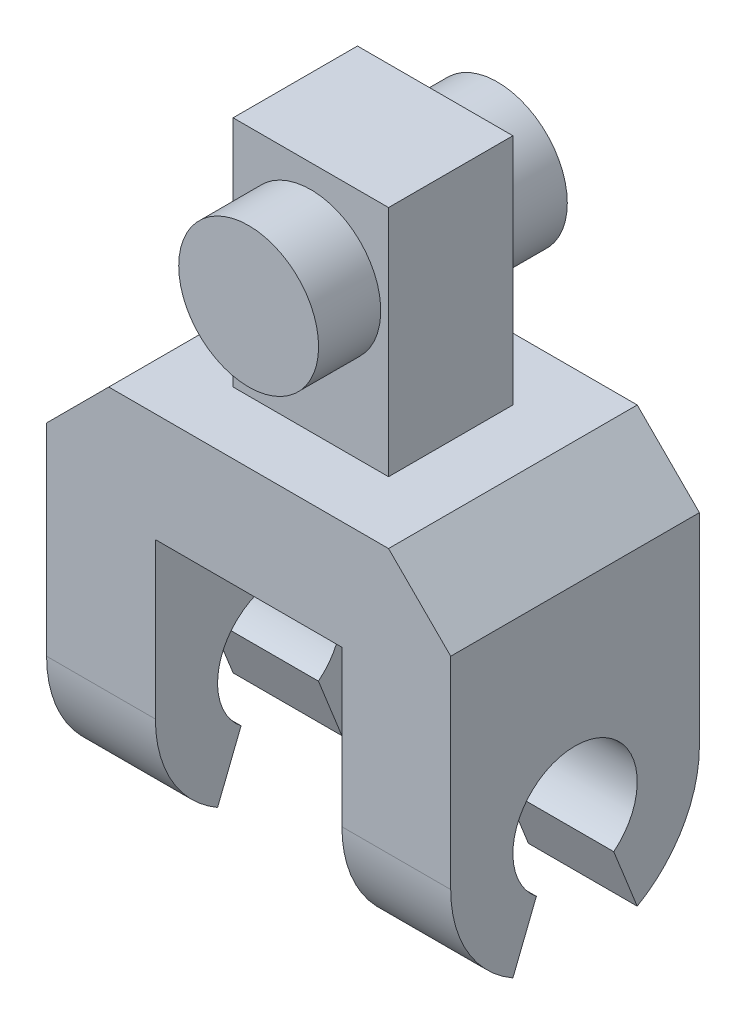
ISO-10303-21;
HEADER;
FILE_DESCRIPTION(('STEP AP214'),'2;1');
FILE_NAME('part.step','',(''),(''),'','','');
FILE_SCHEMA(('AUTOMOTIVE_DESIGN { 1 0 10303 214 1 1 1 1 }'));
ENDSEC;
DATA;
#1=APPLICATION_CONTEXT('core data for automotive mechanical design processes');
#2=APPLICATION_PROTOCOL_DEFINITION('international standard','automotive_design',2000,#1);
#3=PRODUCT_CONTEXT('',#1,'mechanical');
#4=PRODUCT('Part','Part','',(#3));
#5=PRODUCT_RELATED_PRODUCT_CATEGORY('part','',(#4));
#6=PRODUCT_DEFINITION_FORMATION('','',#4);
#7=PRODUCT_DEFINITION_CONTEXT('part definition',#1,'design');
#8=PRODUCT_DEFINITION('design','',#6,#7);
#9=PRODUCT_DEFINITION_SHAPE('','',#8);
#10=(LENGTH_UNIT() NAMED_UNIT(*) SI_UNIT(.MILLI.,.METRE.));
#11=(NAMED_UNIT(*) PLANE_ANGLE_UNIT() SI_UNIT($,.RADIAN.));
#12=(NAMED_UNIT(*) SI_UNIT($,.STERADIAN.) SOLID_ANGLE_UNIT());
#13=UNCERTAINTY_MEASURE_WITH_UNIT(LENGTH_MEASURE(1.E-05),#10,'distance_accuracy_value','');
#14=(GEOMETRIC_REPRESENTATION_CONTEXT(3) GLOBAL_UNCERTAINTY_ASSIGNED_CONTEXT((#13)) GLOBAL_UNIT_ASSIGNED_CONTEXT((#10,
#11,#12)) REPRESENTATION_CONTEXT('',''));
#15=CARTESIAN_POINT('',(0.,0.,0.));
#16=DIRECTION('',(0.,0.,1.));
#17=DIRECTION('',(1.,0.,0.));
#18=AXIS2_PLACEMENT_3D('',#15,#16,#17);
#19=CARTESIAN_POINT('',(-13.,0.,0.));
#20=DIRECTION('',(1.,0.,0.));
#21=DIRECTION('',(0.,0.,-1.));
#22=AXIS2_PLACEMENT_3D('',#19,#20,#21);
#23=CYLINDRICAL_SURFACE('',#22,8.);
#24=DIRECTION('',(-1.,0.,0.));
#25=VECTOR('',#24,1.);
#26=CARTESIAN_POINT('',(22.3648072874322,-6.92820323027551,4.));
#27=LINE('',#26,#25);
#28=CARTESIAN_POINT('',(-6.,-6.92820323027551,4.));
#29=VERTEX_POINT('',#28);
#30=CARTESIAN_POINT('',(-13.,-6.92820323027551,4.));
#31=VERTEX_POINT('',#30);
#32=EDGE_CURVE('E366',#29,#31,#27,.T.);
#33=ORIENTED_EDGE('',*,*,#32,.F.);
#34=CARTESIAN_POINT('',(-6.,0.,0.));
#35=DIRECTION('',(1.,0.,0.));
#36=DIRECTION('',(0.,0.,-1.));
#37=AXIS2_PLACEMENT_3D('',#34,#35,#36);
#38=CIRCLE('',#37,8.);
#39=CARTESIAN_POINT('',(-6.,0.,8.));
#40=VERTEX_POINT('',#39);
#41=EDGE_CURVE('E215',#40,#29,#38,.T.);
#42=ORIENTED_EDGE('',*,*,#41,.F.);
#43=DIRECTION('',(1.,0.,0.));
#44=VECTOR('',#43,1.);
#45=CARTESIAN_POINT('',(-13.,0.,8.));
#46=LINE('',#45,#44);
#47=CARTESIAN_POINT('',(-13.,0.,8.));
#48=VERTEX_POINT('',#47);
#49=EDGE_CURVE('E241',#48,#40,#46,.T.);
#50=ORIENTED_EDGE('',*,*,#49,.F.);
#51=CARTESIAN_POINT('',(-13.,0.,0.));
#52=DIRECTION('',(1.,0.,0.));
#53=DIRECTION('',(0.,0.,-1.));
#54=AXIS2_PLACEMENT_3D('',#51,#52,#53);
#55=CIRCLE('',#54,8.);
#56=EDGE_CURVE('E222',#48,#31,#55,.T.);
#57=ORIENTED_EDGE('',*,*,#56,.T.);
#58=EDGE_LOOP('',(#33,#42,#50,#57));
#59=FACE_BOUND('',#58,.T.);
#60=ADVANCED_FACE('F43',(#59),#23,.T.);
#61=CARTESIAN_POINT('',(13.,0.,0.));
#62=DIRECTION('',(-1.,0.,0.));
#63=DIRECTION('',(0.,0.,1.));
#64=AXIS2_PLACEMENT_3D('',#61,#62,#63);
#65=CYLINDRICAL_SURFACE('',#64,8.);
#66=CARTESIAN_POINT('',(6.,0.,0.));
#67=DIRECTION('',(1.,0.,0.));
#68=DIRECTION('',(0.,0.,-1.));
#69=AXIS2_PLACEMENT_3D('',#66,#67,#68);
#70=CIRCLE('',#69,8.);
#71=CARTESIAN_POINT('',(6.,0.,8.));
#72=VERTEX_POINT('',#71);
#73=CARTESIAN_POINT('',(6.,-6.92820323027551,4.));
#74=VERTEX_POINT('',#73);
#75=EDGE_CURVE('E322',#72,#74,#70,.T.);
#76=ORIENTED_EDGE('',*,*,#75,.T.);
#77=CARTESIAN_POINT('',(13.,-6.92820323027551,4.));
#78=VERTEX_POINT('',#77);
#79=EDGE_CURVE('E363',#78,#74,#27,.T.);
#80=ORIENTED_EDGE('',*,*,#79,.F.);
#81=CARTESIAN_POINT('',(13.,0.,0.));
#82=DIRECTION('',(1.,0.,0.));
#83=DIRECTION('',(0.,0.,-1.));
#84=AXIS2_PLACEMENT_3D('',#81,#82,#83);
#85=CIRCLE('',#84,8.);
#86=CARTESIAN_POINT('',(13.,0.,8.));
#87=VERTEX_POINT('',#86);
#88=EDGE_CURVE('E317',#87,#78,#85,.T.);
#89=ORIENTED_EDGE('',*,*,#88,.F.);
#90=DIRECTION('',(-1.,0.,0.));
#91=VECTOR('',#90,1.);
#92=CARTESIAN_POINT('',(13.,0.,8.));
#93=LINE('',#92,#91);
#94=EDGE_CURVE('E320',#87,#72,#93,.T.);
#95=ORIENTED_EDGE('',*,*,#94,.T.);
#96=EDGE_LOOP('',(#76,#80,#89,#95));
#97=FACE_BOUND('',#96,.T.);
#98=ADVANCED_FACE('F362',(#97),#65,.T.);
#99=CARTESIAN_POINT('',(0.,17.,0.));
#100=DIRECTION('',(0.,-1.,0.));
#101=DIRECTION('',(0.,0.,-1.));
#102=AXIS2_PLACEMENT_3D('',#99,#100,#101);
#103=PLANE('',#102);
#104=DIRECTION('',(-1.,0.,0.));
#105=VECTOR('',#104,1.);
#106=CARTESIAN_POINT('',(13.,17.,-8.));
#107=LINE('',#106,#105);
#108=CARTESIAN_POINT('',(9.00000000000001,17.,-8.));
#109=VERTEX_POINT('',#108);
#110=CARTESIAN_POINT('',(-9.00000000000001,17.,-8.));
#111=VERTEX_POINT('',#110);
#112=EDGE_CURVE('E341',#109,#111,#107,.T.);
#113=ORIENTED_EDGE('',*,*,#112,.T.);
#114=DIRECTION('',(0.,0.,1.));
#115=VECTOR('',#114,1.);
#116=CARTESIAN_POINT('',(-9.00000000000001,17.,0.));
#117=LINE('',#116,#115);
#118=CARTESIAN_POINT('',(-9.00000000000001,17.,8.));
#119=VERTEX_POINT('',#118);
#120=EDGE_CURVE('E248',#111,#119,#117,.T.);
#121=ORIENTED_EDGE('',*,*,#120,.T.);
#122=DIRECTION('',(1.,0.,0.));
#123=VECTOR('',#122,1.);
#124=CARTESIAN_POINT('',(13.,17.,8.));
#125=LINE('',#124,#123);
#126=CARTESIAN_POINT('',(9.00000000000001,17.,8.));
#127=VERTEX_POINT('',#126);
#128=EDGE_CURVE('E338',#119,#127,#125,.T.);
#129=ORIENTED_EDGE('',*,*,#128,.T.);
#130=DIRECTION('',(0.,0.,-1.));
#131=VECTOR('',#130,1.);
#132=CARTESIAN_POINT('',(9.00000000000001,17.,0.));
#133=LINE('',#132,#131);
#134=EDGE_CURVE('E243',#127,#109,#133,.T.);
#135=ORIENTED_EDGE('',*,*,#134,.T.);
#136=EDGE_LOOP('',(#113,#121,#129,#135));
#137=FACE_BOUND('',#136,.T.);
#138=DIRECTION('',(0.,0.,-1.));
#139=VECTOR('',#138,1.);
#140=CARTESIAN_POINT('',(5.,17.,-4.));
#141=LINE('',#140,#139);
#142=CARTESIAN_POINT('',(5.,17.,4.));
#143=VERTEX_POINT('',#142);
#144=CARTESIAN_POINT('',(5.,17.,-4.));
#145=VERTEX_POINT('',#144);
#146=EDGE_CURVE('E295',#143,#145,#141,.T.);
#147=ORIENTED_EDGE('',*,*,#146,.F.);
#148=DIRECTION('',(1.,0.,0.));
#149=VECTOR('',#148,1.);
#150=CARTESIAN_POINT('',(-5.,17.,4.));
#151=LINE('',#150,#149);
#152=CARTESIAN_POINT('',(-5.,17.,4.));
#153=VERTEX_POINT('',#152);
#154=EDGE_CURVE('E279',#153,#143,#151,.T.);
#155=ORIENTED_EDGE('',*,*,#154,.F.);
#156=DIRECTION('',(0.,0.,1.));
#157=VECTOR('',#156,1.);
#158=CARTESIAN_POINT('',(-5.,17.,-4.));
#159=LINE('',#158,#157);
#160=CARTESIAN_POINT('',(-5.,17.,-4.));
#161=VERTEX_POINT('',#160);
#162=EDGE_CURVE('E289',#161,#153,#159,.T.);
#163=ORIENTED_EDGE('',*,*,#162,.F.);
#164=DIRECTION('',(-1.,0.,0.));
#165=VECTOR('',#164,1.);
#166=CARTESIAN_POINT('',(-5.,17.,-4.));
#167=LINE('',#166,#165);
#168=EDGE_CURVE('E398',#145,#161,#167,.T.);
#169=ORIENTED_EDGE('',*,*,#168,.F.);
#170=EDGE_LOOP('',(#147,#155,#163,#169));
#171=FACE_BOUND('',#170,.T.);
#172=ADVANCED_FACE('F403',(#137,#171),#103,.F.);
#173=CARTESIAN_POINT('',(0.,10.,0.));
#174=DIRECTION('',(0.,-1.,0.));
#175=DIRECTION('',(0.,0.,-1.));
#176=AXIS2_PLACEMENT_3D('',#173,#174,#175);
#177=PLANE('',#176);
#178=DIRECTION('',(-1.,0.,0.));
#179=VECTOR('',#178,1.);
#180=CARTESIAN_POINT('',(13.,10.,-8.));
#181=LINE('',#180,#179);
#182=CARTESIAN_POINT('',(6.,10.,-8.));
#183=VERTEX_POINT('',#182);
#184=CARTESIAN_POINT('',(-6.,10.,-8.));
#185=VERTEX_POINT('',#184);
#186=EDGE_CURVE('E342',#183,#185,#181,.T.);
#187=ORIENTED_EDGE('',*,*,#186,.F.);
#188=DIRECTION('',(0.,0.,1.));
#189=VECTOR('',#188,1.);
#190=CARTESIAN_POINT('',(6.,10.,8.));
#191=LINE('',#190,#189);
#192=CARTESIAN_POINT('',(6.,10.,8.));
#193=VERTEX_POINT('',#192);
#194=EDGE_CURVE('E327',#183,#193,#191,.T.);
#195=ORIENTED_EDGE('',*,*,#194,.T.);
#196=DIRECTION('',(1.,0.,0.));
#197=VECTOR('',#196,1.);
#198=CARTESIAN_POINT('',(13.,10.,8.));
#199=LINE('',#198,#197);
#200=CARTESIAN_POINT('',(-6.,10.,8.));
#201=VERTEX_POINT('',#200);
#202=EDGE_CURVE('E337',#201,#193,#199,.T.);
#203=ORIENTED_EDGE('',*,*,#202,.F.);
#204=DIRECTION('',(0.,0.,1.));
#205=VECTOR('',#204,1.);
#206=CARTESIAN_POINT('',(-6.,10.,8.));
#207=LINE('',#206,#205);
#208=EDGE_CURVE('E235',#185,#201,#207,.T.);
#209=ORIENTED_EDGE('',*,*,#208,.F.);
#210=EDGE_LOOP('',(#187,#195,#203,#209));
#211=FACE_BOUND('',#210,.T.);
#212=ADVANCED_FACE('F431',(#211),#177,.T.);
#213=DIRECTION('',(-1.,0.,0.));
#214=VECTOR('',#213,1.);
#215=CARTESIAN_POINT('',(22.3648072874322,-6.92820323027551,-4.));
#216=LINE('',#215,#214);
#217=CARTESIAN_POINT('',(-6.,-6.92820323027551,-4.));
#218=VERTEX_POINT('',#217);
#219=CARTESIAN_POINT('',(-13.,-6.92820323027551,-4.));
#220=VERTEX_POINT('',#219);
#221=EDGE_CURVE('E374',#218,#220,#216,.T.);
#222=ORIENTED_EDGE('',*,*,#221,.T.);
#223=CARTESIAN_POINT('',(-13.,0.,-8.));
#224=VERTEX_POINT('',#223);
#225=EDGE_CURVE('E208',#220,#224,#55,.T.);
#226=ORIENTED_EDGE('',*,*,#225,.T.);
#227=DIRECTION('',(1.,0.,0.));
#228=VECTOR('',#227,1.);
#229=CARTESIAN_POINT('',(-13.,0.,-8.));
#230=LINE('',#229,#228);
#231=CARTESIAN_POINT('',(-6.,0.,-8.));
#232=VERTEX_POINT('',#231);
#233=EDGE_CURVE('E229',#224,#232,#230,.T.);
#234=ORIENTED_EDGE('',*,*,#233,.T.);
#235=EDGE_CURVE('E212',#218,#232,#38,.T.);
#236=ORIENTED_EDGE('',*,*,#235,.F.);
#237=EDGE_LOOP('',(#222,#226,#234,#236));
#238=FACE_BOUND('',#237,.T.);
#239=ADVANCED_FACE('F421',(#238),#23,.T.);
#240=CARTESIAN_POINT('',(-13.,0.,8.));
#241=DIRECTION('',(0.,0.,1.));
#242=DIRECTION('',(1.,0.,0.));
#243=AXIS2_PLACEMENT_3D('',#240,#241,#242);
#244=PLANE('',#243);
#245=ORIENTED_EDGE('',*,*,#128,.F.);
#246=DIRECTION('',(0.707106781186546,0.707106781186549,0.));
#247=VECTOR('',#246,1.);
#248=CARTESIAN_POINT('',(-19.5,6.49999999999997,8.));
#249=LINE('',#248,#247);
#250=CARTESIAN_POINT('',(-13.,13.,8.));
#251=VERTEX_POINT('',#250);
#252=EDGE_CURVE('E253',#119,#251,#249,.F.);
#253=ORIENTED_EDGE('',*,*,#252,.T.);
#254=DIRECTION('',(0.,-1.,0.));
#255=VECTOR('',#254,1.);
#256=CARTESIAN_POINT('',(-13.,0.,8.));
#257=LINE('',#256,#255);
#258=EDGE_CURVE('E228',#251,#48,#257,.T.);
#259=ORIENTED_EDGE('',*,*,#258,.T.);
#260=ORIENTED_EDGE('',*,*,#49,.T.);
#261=DIRECTION('',(0.,-1.,0.));
#262=VECTOR('',#261,1.);
#263=CARTESIAN_POINT('',(-6.,0.,8.));
#264=LINE('',#263,#262);
#265=EDGE_CURVE('E238',#201,#40,#264,.T.);
#266=ORIENTED_EDGE('',*,*,#265,.F.);
#267=ORIENTED_EDGE('',*,*,#202,.T.);
#268=DIRECTION('',(0.,-1.,0.));
#269=VECTOR('',#268,1.);
#270=CARTESIAN_POINT('',(6.,0.,8.));
#271=LINE('',#270,#269);
#272=EDGE_CURVE('E330',#193,#72,#271,.T.);
#273=ORIENTED_EDGE('',*,*,#272,.T.);
#274=ORIENTED_EDGE('',*,*,#94,.F.);
#275=DIRECTION('',(0.,-1.,0.));
#276=VECTOR('',#275,1.);
#277=CARTESIAN_POINT('',(13.,17.,8.));
#278=LINE('',#277,#276);
#279=CARTESIAN_POINT('',(13.,13.,8.));
#280=VERTEX_POINT('',#279);
#281=EDGE_CURVE('E217',#280,#87,#278,.T.);
#282=ORIENTED_EDGE('',*,*,#281,.F.);
#283=DIRECTION('',(0.707106781186546,-0.707106781186549,0.));
#284=VECTOR('',#283,1.);
#285=CARTESIAN_POINT('',(6.50000000000004,19.5,8.));
#286=LINE('',#285,#284);
#287=EDGE_CURVE('E251',#280,#127,#286,.F.);
#288=ORIENTED_EDGE('',*,*,#287,.T.);
#289=EDGE_LOOP('',(#245,#253,#259,#260,#266,#267,#273,#274,#282,#288));
#290=FACE_BOUND('',#289,.T.);
#291=ADVANCED_FACE('F358',(#290),#244,.T.);
#292=CARTESIAN_POINT('',(-13.,10.,-8.));
#293=DIRECTION('',(0.,0.,-1.));
#294=DIRECTION('',(0.,1.,0.));
#295=AXIS2_PLACEMENT_3D('',#292,#293,#294);
#296=PLANE('',#295);
#297=DIRECTION('',(0.,1.,0.));
#298=VECTOR('',#297,1.);
#299=CARTESIAN_POINT('',(-13.,10.,-8.));
#300=LINE('',#299,#298);
#301=CARTESIAN_POINT('',(-13.,13.,-8.));
#302=VERTEX_POINT('',#301);
#303=EDGE_CURVE('E225',#224,#302,#300,.T.);
#304=ORIENTED_EDGE('',*,*,#303,.T.);
#305=DIRECTION('',(-0.707106781186546,-0.707106781186549,0.));
#306=VECTOR('',#305,1.);
#307=CARTESIAN_POINT('',(-14.5,11.5,-8.));
#308=LINE('',#307,#306);
#309=EDGE_CURVE('E259',#302,#111,#308,.F.);
#310=ORIENTED_EDGE('',*,*,#309,.T.);
#311=ORIENTED_EDGE('',*,*,#112,.F.);
#312=DIRECTION('',(-0.707106781186546,0.707106781186549,0.));
#313=VECTOR('',#312,1.);
#314=CARTESIAN_POINT('',(1.50000000000004,24.5,-8.));
#315=LINE('',#314,#313);
#316=CARTESIAN_POINT('',(13.,13.,-8.));
#317=VERTEX_POINT('',#316);
#318=EDGE_CURVE('E257',#109,#317,#315,.F.);
#319=ORIENTED_EDGE('',*,*,#318,.T.);
#320=DIRECTION('',(0.,-1.,0.));
#321=VECTOR('',#320,1.);
#322=CARTESIAN_POINT('',(13.,17.,-8.));
#323=LINE('',#322,#321);
#324=CARTESIAN_POINT('',(13.,0.,-8.));
#325=VERTEX_POINT('',#324);
#326=EDGE_CURVE('E345',#317,#325,#323,.T.);
#327=ORIENTED_EDGE('',*,*,#326,.T.);
#328=DIRECTION('',(-1.,0.,0.));
#329=VECTOR('',#328,1.);
#330=CARTESIAN_POINT('',(13.,0.,-8.));
#331=LINE('',#330,#329);
#332=CARTESIAN_POINT('',(6.,0.,-8.));
#333=VERTEX_POINT('',#332);
#334=EDGE_CURVE('E334',#325,#333,#331,.T.);
#335=ORIENTED_EDGE('',*,*,#334,.T.);
#336=DIRECTION('',(0.,1.,0.));
#337=VECTOR('',#336,1.);
#338=CARTESIAN_POINT('',(6.,10.,-8.));
#339=LINE('',#338,#337);
#340=EDGE_CURVE('E325',#333,#183,#339,.T.);
#341=ORIENTED_EDGE('',*,*,#340,.T.);
#342=ORIENTED_EDGE('',*,*,#186,.T.);
#343=DIRECTION('',(0.,1.,0.));
#344=VECTOR('',#343,1.);
#345=CARTESIAN_POINT('',(-6.,10.,-8.));
#346=LINE('',#345,#344);
#347=EDGE_CURVE('E232',#232,#185,#346,.T.);
#348=ORIENTED_EDGE('',*,*,#347,.F.);
#349=ORIENTED_EDGE('',*,*,#233,.F.);
#350=EDGE_LOOP('',(#304,#310,#311,#319,#327,#335,#341,#342,#348,#349));
#351=FACE_BOUND('',#350,.T.);
#352=ADVANCED_FACE('F437',(#351),#296,.T.);
#353=CARTESIAN_POINT('',(-13.,0.,0.));
#354=DIRECTION('',(1.,0.,0.));
#355=DIRECTION('',(0.,0.,-1.));
#356=AXIS2_PLACEMENT_3D('',#353,#354,#355);
#357=PLANE('',#356);
#358=CARTESIAN_POINT('',(-13.,0.,0.));
#359=DIRECTION('',(1.,0.,0.));
#360=DIRECTION('',(0.,0.,-1.));
#361=AXIS2_PLACEMENT_3D('',#358,#359,#360);
#362=CIRCLE('',#361,4.);
#363=CARTESIAN_POINT('',(-13.,-3.13177490960591,-2.48837013234826));
#364=VERTEX_POINT('',#363);
#365=CARTESIAN_POINT('',(-13.,-3.13177490960591,2.48837013234826));
#366=VERTEX_POINT('',#365);
#367=EDGE_CURVE('E206',#364,#366,#362,.T.);
#368=ORIENTED_EDGE('',*,*,#367,.T.);
#369=DIRECTION('',(0.,0.929061299169729,-0.369925806595128));
#370=VECTOR('',#369,1.);
#371=CARTESIAN_POINT('',(-13.,-3.13177490960591,2.48837013234826));
#372=LINE('',#371,#370);
#373=EDGE_CURVE('E68',#31,#366,#372,.T.);
#374=ORIENTED_EDGE('',*,*,#373,.F.);
#375=ORIENTED_EDGE('',*,*,#56,.F.);
#376=ORIENTED_EDGE('',*,*,#258,.F.);
#377=DIRECTION('',(0.,0.,-1.));
#378=VECTOR('',#377,1.);
#379=CARTESIAN_POINT('',(-13.,13.,0.));
#380=LINE('',#379,#378);
#381=EDGE_CURVE('E255',#251,#302,#380,.T.);
#382=ORIENTED_EDGE('',*,*,#381,.T.);
#383=ORIENTED_EDGE('',*,*,#303,.F.);
#384=ORIENTED_EDGE('',*,*,#225,.F.);
#385=DIRECTION('',(0.,-0.929061299169729,-0.369925806595128));
#386=VECTOR('',#385,1.);
#387=CARTESIAN_POINT('',(-13.,-3.13177490960591,-2.48837013234826));
#388=LINE('',#387,#386);
#389=EDGE_CURVE('E194',#364,#220,#388,.T.);
#390=ORIENTED_EDGE('',*,*,#389,.F.);
#391=EDGE_LOOP('',(#368,#374,#375,#376,#382,#383,#384,#390));
#392=FACE_BOUND('',#391,.T.);
#393=ADVANCED_FACE('F205',(#392),#357,.F.);
#394=CARTESIAN_POINT('',(-6.,0.,0.));
#395=DIRECTION('',(1.,0.,0.));
#396=DIRECTION('',(0.,0.,-1.));
#397=AXIS2_PLACEMENT_3D('',#394,#395,#396);
#398=PLANE('',#397);
#399=DIRECTION('',(0.,-0.929061299169729,0.369925806595128));
#400=VECTOR('',#399,1.);
#401=CARTESIAN_POINT('',(-6.,0.42664432149519,1.07150872024869));
#402=LINE('',#401,#400);
#403=CARTESIAN_POINT('',(-6.,-3.13177490960591,2.48837013234826));
#404=VERTEX_POINT('',#403);
#405=EDGE_CURVE('E385',#404,#29,#402,.T.);
#406=ORIENTED_EDGE('',*,*,#405,.F.);
#407=CARTESIAN_POINT('',(-6.,0.,0.));
#408=DIRECTION('',(1.,0.,0.));
#409=DIRECTION('',(0.,0.,-1.));
#410=AXIS2_PLACEMENT_3D('',#407,#408,#409);
#411=CIRCLE('',#410,4.);
#412=CARTESIAN_POINT('',(-6.,-3.13177490960591,-2.48837013234826));
#413=VERTEX_POINT('',#412);
#414=EDGE_CURVE('E213',#413,#404,#411,.T.);
#415=ORIENTED_EDGE('',*,*,#414,.F.);
#416=DIRECTION('',(0.,0.929061299169729,0.369925806595128));
#417=VECTOR('',#416,1.);
#418=CARTESIAN_POINT('',(-6.,0.42664432149519,-1.07150872024869));
#419=LINE('',#418,#417);
#420=EDGE_CURVE('E60',#218,#413,#419,.T.);
#421=ORIENTED_EDGE('',*,*,#420,.F.);
#422=ORIENTED_EDGE('',*,*,#235,.T.);
#423=ORIENTED_EDGE('',*,*,#347,.T.);
#424=ORIENTED_EDGE('',*,*,#208,.T.);
#425=ORIENTED_EDGE('',*,*,#265,.T.);
#426=ORIENTED_EDGE('',*,*,#41,.T.);
#427=EDGE_LOOP('',(#406,#415,#421,#422,#423,#424,#425,#426));
#428=FACE_BOUND('',#427,.T.);
#429=ADVANCED_FACE('F446',(#428),#398,.T.);
#430=CARTESIAN_POINT('',(-13.,0.,0.));
#431=DIRECTION('',(1.,0.,0.));
#432=DIRECTION('',(0.,0.,-1.));
#433=AXIS2_PLACEMENT_3D('',#430,#431,#432);
#434=CYLINDRICAL_SURFACE('',#433,4.);
#435=ORIENTED_EDGE('',*,*,#414,.T.);
#436=DIRECTION('',(-1.,0.,0.));
#437=VECTOR('',#436,1.);
#438=CARTESIAN_POINT('',(22.3648072874322,-3.13177490960591,2.48837013234826));
#439=LINE('',#438,#437);
#440=EDGE_CURVE('E211',#404,#366,#439,.T.);
#441=ORIENTED_EDGE('',*,*,#440,.T.);
#442=ORIENTED_EDGE('',*,*,#367,.F.);
#443=DIRECTION('',(-1.,0.,0.));
#444=VECTOR('',#443,1.);
#445=CARTESIAN_POINT('',(22.3648072874322,-3.13177490960591,-2.48837013234826));
#446=LINE('',#445,#444);
#447=EDGE_CURVE('E191',#413,#364,#446,.T.);
#448=ORIENTED_EDGE('',*,*,#447,.F.);
#449=EDGE_LOOP('',(#435,#441,#442,#448));
#450=FACE_BOUND('',#449,.T.);
#451=ADVANCED_FACE('F210',(#450),#434,.F.);
#452=CARTESIAN_POINT('',(13.,17.,-8.));
#453=DIRECTION('',(-1.,0.,0.));
#454=DIRECTION('',(0.,0.,1.));
#455=AXIS2_PLACEMENT_3D('',#452,#453,#454);
#456=PLANE('',#455);
#457=ORIENTED_EDGE('',*,*,#88,.T.);
#458=DIRECTION('',(0.,-0.929061299169729,0.369925806595128));
#459=VECTOR('',#458,1.);
#460=CARTESIAN_POINT('',(13.,-3.13177490960591,2.48837013234826));
#461=LINE('',#460,#459);
#462=CARTESIAN_POINT('',(13.,-3.13177490960591,2.48837013234826));
#463=VERTEX_POINT('',#462);
#464=EDGE_CURVE('E379',#463,#78,#461,.T.);
#465=ORIENTED_EDGE('',*,*,#464,.F.);
#466=CARTESIAN_POINT('',(13.,0.,0.));
#467=DIRECTION('',(1.,0.,0.));
#468=DIRECTION('',(0.,0.,-1.));
#469=AXIS2_PLACEMENT_3D('',#466,#467,#468);
#470=CIRCLE('',#469,4.);
#471=CARTESIAN_POINT('',(13.,-3.13177490960591,-2.48837013234826));
#472=VERTEX_POINT('',#471);
#473=EDGE_CURVE('E311',#472,#463,#470,.T.);
#474=ORIENTED_EDGE('',*,*,#473,.F.);
#475=DIRECTION('',(0.,0.929061299169729,0.369925806595128));
#476=VECTOR('',#475,1.);
#477=CARTESIAN_POINT('',(13.,-3.13177490960591,-2.48837013234826));
#478=LINE('',#477,#476);
#479=CARTESIAN_POINT('',(13.,-6.92820323027551,-4.));
#480=VERTEX_POINT('',#479);
#481=EDGE_CURVE('E376',#480,#472,#478,.T.);
#482=ORIENTED_EDGE('',*,*,#481,.F.);
#483=EDGE_CURVE('E321',#480,#325,#85,.T.);
#484=ORIENTED_EDGE('',*,*,#483,.T.);
#485=ORIENTED_EDGE('',*,*,#326,.F.);
#486=DIRECTION('',(0.,0.,1.));
#487=VECTOR('',#486,1.);
#488=CARTESIAN_POINT('',(13.,13.,-8.));
#489=LINE('',#488,#487);
#490=EDGE_CURVE('E260',#317,#280,#489,.T.);
#491=ORIENTED_EDGE('',*,*,#490,.T.);
#492=ORIENTED_EDGE('',*,*,#281,.T.);
#493=EDGE_LOOP('',(#457,#465,#474,#482,#484,#485,#491,#492));
#494=FACE_BOUND('',#493,.T.);
#495=ADVANCED_FACE('F352',(#494),#456,.F.);
#496=CARTESIAN_POINT('',(6.,0.,0.));
#497=DIRECTION('',(1.,0.,0.));
#498=DIRECTION('',(0.,0.,-1.));
#499=AXIS2_PLACEMENT_3D('',#496,#497,#498);
#500=PLANE('',#499);
#501=CARTESIAN_POINT('',(6.,0.,0.));
#502=DIRECTION('',(1.,0.,0.));
#503=DIRECTION('',(0.,0.,-1.));
#504=AXIS2_PLACEMENT_3D('',#501,#502,#503);
#505=CIRCLE('',#504,4.);
#506=CARTESIAN_POINT('',(6.,-3.13177490960591,-2.48837013234826));
#507=VERTEX_POINT('',#506);
#508=CARTESIAN_POINT('',(6.,-3.13177490960591,2.48837013234826));
#509=VERTEX_POINT('',#508);
#510=EDGE_CURVE('E310',#507,#509,#505,.T.);
#511=ORIENTED_EDGE('',*,*,#510,.T.);
#512=DIRECTION('',(0.,-0.929061299169729,0.369925806595128));
#513=VECTOR('',#512,1.);
#514=CARTESIAN_POINT('',(6.,0.42664432149519,1.07150872024869));
#515=LINE('',#514,#513);
#516=EDGE_CURVE('E383',#509,#74,#515,.T.);
#517=ORIENTED_EDGE('',*,*,#516,.T.);
#518=ORIENTED_EDGE('',*,*,#75,.F.);
#519=ORIENTED_EDGE('',*,*,#272,.F.);
#520=ORIENTED_EDGE('',*,*,#194,.F.);
#521=ORIENTED_EDGE('',*,*,#340,.F.);
#522=CARTESIAN_POINT('',(6.,-6.92820323027551,-4.));
#523=VERTEX_POINT('',#522);
#524=EDGE_CURVE('E314',#523,#333,#70,.T.);
#525=ORIENTED_EDGE('',*,*,#524,.F.);
#526=DIRECTION('',(0.,0.929061299169729,0.369925806595128));
#527=VECTOR('',#526,1.);
#528=CARTESIAN_POINT('',(6.,0.42664432149519,-1.07150872024869));
#529=LINE('',#528,#527);
#530=EDGE_CURVE('E378',#523,#507,#529,.T.);
#531=ORIENTED_EDGE('',*,*,#530,.T.);
#532=EDGE_LOOP('',(#511,#517,#518,#519,#520,#521,#525,#531));
#533=FACE_BOUND('',#532,.T.);
#534=ADVANCED_FACE('F461',(#533),#500,.F.);
#535=ORIENTED_EDGE('',*,*,#483,.F.);
#536=EDGE_CURVE('E370',#480,#523,#216,.T.);
#537=ORIENTED_EDGE('',*,*,#536,.T.);
#538=ORIENTED_EDGE('',*,*,#524,.T.);
#539=ORIENTED_EDGE('',*,*,#334,.F.);
#540=EDGE_LOOP('',(#535,#537,#538,#539));
#541=FACE_BOUND('',#540,.T.);
#542=ADVANCED_FACE('F427',(#541),#65,.T.);
#543=CARTESIAN_POINT('',(13.,0.,0.));
#544=DIRECTION('',(-1.,0.,0.));
#545=DIRECTION('',(0.,0.,1.));
#546=AXIS2_PLACEMENT_3D('',#543,#544,#545);
#547=CYLINDRICAL_SURFACE('',#546,4.);
#548=EDGE_CURVE('E368',#463,#509,#439,.T.);
#549=ORIENTED_EDGE('',*,*,#548,.T.);
#550=ORIENTED_EDGE('',*,*,#510,.F.);
#551=EDGE_CURVE('E200',#472,#507,#446,.T.);
#552=ORIENTED_EDGE('',*,*,#551,.F.);
#553=ORIENTED_EDGE('',*,*,#473,.T.);
#554=EDGE_LOOP('',(#549,#550,#552,#553));
#555=FACE_BOUND('',#554,.T.);
#556=ADVANCED_FACE('F457',(#555),#547,.F.);
#557=CARTESIAN_POINT('',(-9.00000000000001,17.,0.));
#558=DIRECTION('',(0.707106781186549,-0.707106781186546,0.));
#559=DIRECTION('',(0.,0.,1.));
#560=AXIS2_PLACEMENT_3D('',#557,#558,#559);
#561=PLANE('',#560);
#562=ORIENTED_EDGE('',*,*,#309,.F.);
#563=ORIENTED_EDGE('',*,*,#381,.F.);
#564=ORIENTED_EDGE('',*,*,#252,.F.);
#565=ORIENTED_EDGE('',*,*,#120,.F.);
#566=EDGE_LOOP('',(#562,#563,#564,#565));
#567=FACE_BOUND('',#566,.T.);
#568=ADVANCED_FACE('F476',(#567),#561,.F.);
#569=CARTESIAN_POINT('',(9.00000000000001,17.,0.));
#570=DIRECTION('',(-0.707106781186549,-0.707106781186546,0.));
#571=DIRECTION('',(0.,0.,-1.));
#572=AXIS2_PLACEMENT_3D('',#569,#570,#571);
#573=PLANE('',#572);
#574=ORIENTED_EDGE('',*,*,#287,.F.);
#575=ORIENTED_EDGE('',*,*,#490,.F.);
#576=ORIENTED_EDGE('',*,*,#318,.F.);
#577=ORIENTED_EDGE('',*,*,#134,.F.);
#578=EDGE_LOOP('',(#574,#575,#576,#577));
#579=FACE_BOUND('',#578,.T.);
#580=ADVANCED_FACE('F46',(#579),#573,.F.);
#581=CARTESIAN_POINT('',(5.,32.,-4.));
#582=DIRECTION('',(-1.,0.,0.));
#583=DIRECTION('',(0.,0.,1.));
#584=AXIS2_PLACEMENT_3D('',#581,#582,#583);
#585=PLANE('',#584);
#586=ORIENTED_EDGE('',*,*,#146,.T.);
#587=DIRECTION('',(0.,-1.,0.));
#588=VECTOR('',#587,1.);
#589=CARTESIAN_POINT('',(5.,32.,-4.));
#590=LINE('',#589,#588);
#591=CARTESIAN_POINT('',(5.,32.,-4.));
#592=VERTEX_POINT('',#591);
#593=EDGE_CURVE('E307',#592,#145,#590,.T.);
#594=ORIENTED_EDGE('',*,*,#593,.F.);
#595=DIRECTION('',(0.,0.,-1.));
#596=VECTOR('',#595,1.);
#597=CARTESIAN_POINT('',(5.,32.,-4.));
#598=LINE('',#597,#596);
#599=CARTESIAN_POINT('',(5.,32.,4.));
#600=VERTEX_POINT('',#599);
#601=EDGE_CURVE('E288',#600,#592,#598,.T.);
#602=ORIENTED_EDGE('',*,*,#601,.F.);
#603=DIRECTION('',(0.,-1.,0.));
#604=VECTOR('',#603,1.);
#605=CARTESIAN_POINT('',(5.,32.,4.));
#606=LINE('',#605,#604);
#607=EDGE_CURVE('E282',#600,#143,#606,.T.);
#608=ORIENTED_EDGE('',*,*,#607,.T.);
#609=EDGE_LOOP('',(#586,#594,#602,#608));
#610=FACE_BOUND('',#609,.T.);
#611=ADVANCED_FACE('F293',(#610),#585,.F.);
#612=CARTESIAN_POINT('',(-5.,32.,-4.));
#613=DIRECTION('',(0.,0.,1.));
#614=DIRECTION('',(1.,0.,0.));
#615=AXIS2_PLACEMENT_3D('',#612,#613,#614);
#616=PLANE('',#615);
#617=CARTESIAN_POINT('',(0.,26.,-4.));
#618=DIRECTION('',(0.,0.,1.));
#619=DIRECTION('',(1.,0.,0.));
#620=AXIS2_PLACEMENT_3D('',#617,#618,#619);
#621=CIRCLE('',#620,4.5);
#622=CARTESIAN_POINT('',(4.5,26.,-4.));
#623=VERTEX_POINT('',#622);
#624=EDGE_CURVE('E11',#623,#623,#621,.F.);
#625=ORIENTED_EDGE('',*,*,#624,.F.);
#626=EDGE_LOOP('',(#625));
#627=FACE_BOUND('',#626,.T.);
#628=ORIENTED_EDGE('',*,*,#168,.T.);
#629=DIRECTION('',(0.,-1.,0.));
#630=VECTOR('',#629,1.);
#631=CARTESIAN_POINT('',(-5.,32.,-4.));
#632=LINE('',#631,#630);
#633=CARTESIAN_POINT('',(-5.,32.,-4.));
#634=VERTEX_POINT('',#633);
#635=EDGE_CURVE('E299',#634,#161,#632,.T.);
#636=ORIENTED_EDGE('',*,*,#635,.F.);
#637=DIRECTION('',(-1.,0.,0.));
#638=VECTOR('',#637,1.);
#639=CARTESIAN_POINT('',(-5.,32.,-4.));
#640=LINE('',#639,#638);
#641=EDGE_CURVE('E394',#592,#634,#640,.T.);
#642=ORIENTED_EDGE('',*,*,#641,.F.);
#643=ORIENTED_EDGE('',*,*,#593,.T.);
#644=EDGE_LOOP('',(#628,#636,#642,#643));
#645=FACE_BOUND('',#644,.T.);
#646=ADVANCED_FACE('F405',(#627,#645),#616,.F.);
#647=CARTESIAN_POINT('',(-5.,32.,-4.));
#648=DIRECTION('',(1.,0.,0.));
#649=DIRECTION('',(0.,0.,-1.));
#650=AXIS2_PLACEMENT_3D('',#647,#648,#649);
#651=PLANE('',#650);
#652=ORIENTED_EDGE('',*,*,#162,.T.);
#653=DIRECTION('',(0.,-1.,0.));
#654=VECTOR('',#653,1.);
#655=CARTESIAN_POINT('',(-5.,32.,4.));
#656=LINE('',#655,#654);
#657=CARTESIAN_POINT('',(-5.,32.,4.));
#658=VERTEX_POINT('',#657);
#659=EDGE_CURVE('E285',#658,#153,#656,.T.);
#660=ORIENTED_EDGE('',*,*,#659,.F.);
#661=DIRECTION('',(0.,0.,1.));
#662=VECTOR('',#661,1.);
#663=CARTESIAN_POINT('',(-5.,32.,-4.));
#664=LINE('',#663,#662);
#665=EDGE_CURVE('E301',#634,#658,#664,.T.);
#666=ORIENTED_EDGE('',*,*,#665,.F.);
#667=ORIENTED_EDGE('',*,*,#635,.T.);
#668=EDGE_LOOP('',(#652,#660,#666,#667));
#669=FACE_BOUND('',#668,.T.);
#670=ADVANCED_FACE('F274',(#669),#651,.F.);
#671=CARTESIAN_POINT('',(-5.,32.,4.));
#672=DIRECTION('',(0.,0.,-1.));
#673=DIRECTION('',(-1.,0.,0.));
#674=AXIS2_PLACEMENT_3D('',#671,#672,#673);
#675=PLANE('',#674);
#676=CARTESIAN_POINT('',(0.,26.,4.));
#677=DIRECTION('',(0.,0.,-1.));
#678=DIRECTION('',(-1.,0.,0.));
#679=AXIS2_PLACEMENT_3D('',#676,#677,#678);
#680=CIRCLE('',#679,4.5);
#681=CARTESIAN_POINT('',(-4.5,26.,4.));
#682=VERTEX_POINT('',#681);
#683=EDGE_CURVE('E48',#682,#682,#680,.F.);
#684=ORIENTED_EDGE('',*,*,#683,.F.);
#685=EDGE_LOOP('',(#684));
#686=FACE_BOUND('',#685,.T.);
#687=ORIENTED_EDGE('',*,*,#154,.T.);
#688=ORIENTED_EDGE('',*,*,#607,.F.);
#689=DIRECTION('',(1.,0.,0.));
#690=VECTOR('',#689,1.);
#691=CARTESIAN_POINT('',(-5.,32.,4.));
#692=LINE('',#691,#690);
#693=EDGE_CURVE('E297',#658,#600,#692,.T.);
#694=ORIENTED_EDGE('',*,*,#693,.F.);
#695=ORIENTED_EDGE('',*,*,#659,.T.);
#696=EDGE_LOOP('',(#687,#688,#694,#695));
#697=FACE_BOUND('',#696,.T.);
#698=ADVANCED_FACE('F270',(#686,#697),#675,.F.);
#699=CARTESIAN_POINT('',(0.,32.,0.));
#700=DIRECTION('',(0.,1.,0.));
#701=DIRECTION('',(0.,0.,1.));
#702=AXIS2_PLACEMENT_3D('',#699,#700,#701);
#703=PLANE('',#702);
#704=ORIENTED_EDGE('',*,*,#601,.T.);
#705=ORIENTED_EDGE('',*,*,#641,.T.);
#706=ORIENTED_EDGE('',*,*,#665,.T.);
#707=ORIENTED_EDGE('',*,*,#693,.T.);
#708=EDGE_LOOP('',(#704,#705,#706,#707));
#709=FACE_BOUND('',#708,.T.);
#710=ADVANCED_FACE('F273',(#709),#703,.T.);
#711=CARTESIAN_POINT('',(0.,26.,8.));
#712=DIRECTION('',(0.,0.,1.));
#713=DIRECTION('',(1.,0.,0.));
#714=AXIS2_PLACEMENT_3D('',#711,#712,#713);
#715=PLANE('',#714);
#716=CARTESIAN_POINT('',(0.,26.,8.));
#717=DIRECTION('',(0.,0.,1.));
#718=DIRECTION('',(1.,0.,0.));
#719=AXIS2_PLACEMENT_3D('',#716,#717,#718);
#720=CIRCLE('',#719,4.5);
#721=CARTESIAN_POINT('',(4.5,26.,8.));
#722=VERTEX_POINT('',#721);
#723=EDGE_CURVE('E388',#722,#722,#720,.T.);
#724=ORIENTED_EDGE('',*,*,#723,.T.);
#725=EDGE_LOOP('',(#724));
#726=FACE_BOUND('',#725,.T.);
#727=ADVANCED_FACE('F408',(#726),#715,.T.);
#728=CARTESIAN_POINT('',(0.,26.,8.));
#729=DIRECTION('',(0.,0.,-1.));
#730=DIRECTION('',(-1.,0.,0.));
#731=AXIS2_PLACEMENT_3D('',#728,#729,#730);
#732=CYLINDRICAL_SURFACE('',#731,4.5);
#733=ORIENTED_EDGE('',*,*,#723,.F.);
#734=EDGE_LOOP('',(#733));
#735=FACE_BOUND('',#734,.T.);
#736=ORIENTED_EDGE('',*,*,#683,.T.);
#737=EDGE_LOOP('',(#736));
#738=FACE_BOUND('',#737,.T.);
#739=ADVANCED_FACE('F268',(#735,#738),#732,.T.);
#740=CARTESIAN_POINT('',(0.,26.,-8.));
#741=DIRECTION('',(0.,0.,1.));
#742=DIRECTION('',(1.,0.,0.));
#743=AXIS2_PLACEMENT_3D('',#740,#741,#742);
#744=CIRCLE('',#743,4.5);
#745=CARTESIAN_POINT('',(4.5,26.,-8.));
#746=VERTEX_POINT('',#745);
#747=EDGE_CURVE('E387',#746,#746,#744,.T.);
#748=ORIENTED_EDGE('',*,*,#747,.T.);
#749=EDGE_LOOP('',(#748));
#750=FACE_BOUND('',#749,.T.);
#751=ORIENTED_EDGE('',*,*,#624,.T.);
#752=EDGE_LOOP('',(#751));
#753=FACE_BOUND('',#752,.T.);
#754=ADVANCED_FACE('F658',(#750,#753),#732,.T.);
#755=CARTESIAN_POINT('',(0.,26.,-8.));
#756=DIRECTION('',(0.,0.,1.));
#757=DIRECTION('',(1.,0.,0.));
#758=AXIS2_PLACEMENT_3D('',#755,#756,#757);
#759=PLANE('',#758);
#760=ORIENTED_EDGE('',*,*,#747,.F.);
#761=EDGE_LOOP('',(#760));
#762=FACE_BOUND('',#761,.T.);
#763=ADVANCED_FACE('F618',(#762),#759,.F.);
#764=CARTESIAN_POINT('',(22.3648072874322,-3.13177490960591,-2.48837013234826));
#765=DIRECTION('',(0.,0.369925806595128,-0.929061299169729));
#766=DIRECTION('',(0.,0.929061299169729,0.369925806595128));
#767=AXIS2_PLACEMENT_3D('',#764,#765,#766);
#768=PLANE('',#767);
#769=ORIENTED_EDGE('',*,*,#536,.F.);
#770=ORIENTED_EDGE('',*,*,#481,.T.);
#771=ORIENTED_EDGE('',*,*,#551,.T.);
#772=ORIENTED_EDGE('',*,*,#530,.F.);
#773=EDGE_LOOP('',(#769,#770,#771,#772));
#774=FACE_BOUND('',#773,.T.);
#775=ADVANCED_FACE('F465',(#774),#768,.F.);
#776=CARTESIAN_POINT('',(22.3648072874322,-3.13177490960591,2.48837013234826));
#777=DIRECTION('',(0.,0.369925806595128,0.929061299169729));
#778=DIRECTION('',(0.,-0.929061299169729,0.369925806595128));
#779=AXIS2_PLACEMENT_3D('',#776,#777,#778);
#780=PLANE('',#779);
#781=ORIENTED_EDGE('',*,*,#548,.F.);
#782=ORIENTED_EDGE('',*,*,#464,.T.);
#783=ORIENTED_EDGE('',*,*,#79,.T.);
#784=ORIENTED_EDGE('',*,*,#516,.F.);
#785=EDGE_LOOP('',(#781,#782,#783,#784));
#786=FACE_BOUND('',#785,.T.);
#787=ADVANCED_FACE('F617',(#786),#780,.F.);
#788=ORIENTED_EDGE('',*,*,#420,.T.);
#789=ORIENTED_EDGE('',*,*,#447,.T.);
#790=ORIENTED_EDGE('',*,*,#389,.T.);
#791=ORIENTED_EDGE('',*,*,#221,.F.);
#792=EDGE_LOOP('',(#788,#789,#790,#791));
#793=FACE_BOUND('',#792,.T.);
#794=ADVANCED_FACE('F193',(#793),#768,.F.);
#795=ORIENTED_EDGE('',*,*,#405,.T.);
#796=ORIENTED_EDGE('',*,*,#32,.T.);
#797=ORIENTED_EDGE('',*,*,#373,.T.);
#798=ORIENTED_EDGE('',*,*,#440,.F.);
#799=EDGE_LOOP('',(#795,#796,#797,#798));
#800=FACE_BOUND('',#799,.T.);
#801=ADVANCED_FACE('F448',(#800),#780,.F.);
#802=CLOSED_SHELL('',(#60,#98,#172,#212,#239,#291,#352,#393,#429,#451,#495,#534,#542,#556,#568,
#580,#611,#646,#670,#698,#710,#727,#739,#754,#763,#775,#787,#794,#801));
#803=MANIFOLD_SOLID_BREP('B2',#802);
#804=ADVANCED_BREP_SHAPE_REPRESENTATION('',(#18,#803),#14);
#805=SHAPE_DEFINITION_REPRESENTATION(#9,#804);
ENDSEC;
END-ISO-10303-21;
